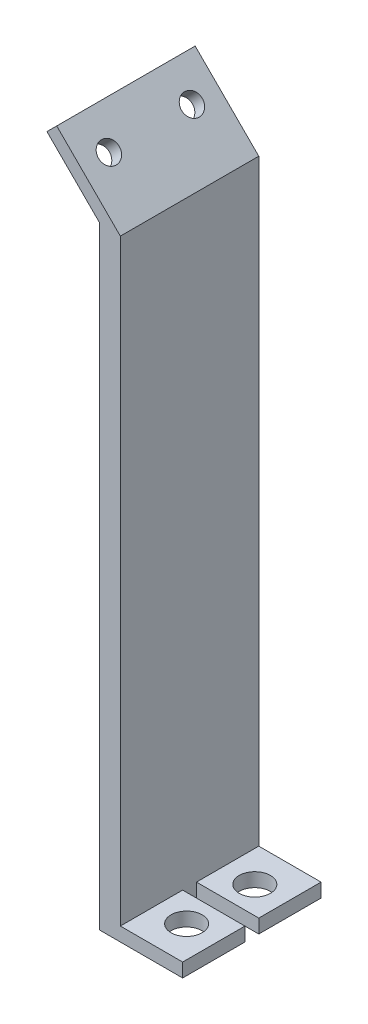
ISO-10303-21;
HEADER;
FILE_DESCRIPTION(('STEP AP214'),'2;1');
FILE_NAME('part.step','',(''),(''),'','','');
FILE_SCHEMA(('AUTOMOTIVE_DESIGN { 1 0 10303 214 1 1 1 1 }'));
ENDSEC;
DATA;
#1=APPLICATION_CONTEXT('core data for automotive mechanical design processes');
#2=APPLICATION_PROTOCOL_DEFINITION('international standard','automotive_design',2000,#1);
#3=PRODUCT_CONTEXT('',#1,'mechanical');
#4=PRODUCT('Part','Part','',(#3));
#5=PRODUCT_RELATED_PRODUCT_CATEGORY('part','',(#4));
#6=PRODUCT_DEFINITION_FORMATION('','',#4);
#7=PRODUCT_DEFINITION_CONTEXT('part definition',#1,'design');
#8=PRODUCT_DEFINITION('design','',#6,#7);
#9=PRODUCT_DEFINITION_SHAPE('','',#8);
#10=(LENGTH_UNIT() NAMED_UNIT(*) SI_UNIT(.MILLI.,.METRE.));
#11=(NAMED_UNIT(*) PLANE_ANGLE_UNIT() SI_UNIT($,.RADIAN.));
#12=(NAMED_UNIT(*) SI_UNIT($,.STERADIAN.) SOLID_ANGLE_UNIT());
#13=UNCERTAINTY_MEASURE_WITH_UNIT(LENGTH_MEASURE(1.E-05),#10,'distance_accuracy_value','');
#14=(GEOMETRIC_REPRESENTATION_CONTEXT(3) GLOBAL_UNCERTAINTY_ASSIGNED_CONTEXT((#13)) GLOBAL_UNIT_ASSIGNED_CONTEXT((#10,
#11,#12)) REPRESENTATION_CONTEXT('',''));
#15=CARTESIAN_POINT('',(0.,0.,0.));
#16=DIRECTION('',(0.,0.,1.));
#17=DIRECTION('',(1.,0.,0.));
#18=AXIS2_PLACEMENT_3D('',#15,#16,#17);
#19=CARTESIAN_POINT('',(11.875,-83.5,-5.625));
#20=DIRECTION('',(1.,0.,0.));
#21=DIRECTION('',(0.,1.,0.));
#22=AXIS2_PLACEMENT_3D('',#19,#20,#21);
#23=PLANE('',#22);
#24=DIRECTION('',(0.,0.,1.));
#25=VECTOR('',#24,1.);
#26=CARTESIAN_POINT('',(11.875,-83.5,-5.625));
#27=LINE('',#26,#25);
#28=CARTESIAN_POINT('',(11.875,-83.5,3.37500000000003));
#29=VERTEX_POINT('',#28);
#30=CARTESIAN_POINT('',(11.875,-83.5,5.375));
#31=VERTEX_POINT('',#30);
#32=EDGE_CURVE('E63',#29,#31,#27,.T.);
#33=ORIENTED_EDGE('',*,*,#32,.F.);
#34=DIRECTION('',(0.,-1.,0.));
#35=VECTOR('',#34,1.);
#36=CARTESIAN_POINT('',(11.875,-83.5,3.37500000000003));
#37=LINE('',#36,#35);
#38=CARTESIAN_POINT('',(11.875,-81.5,3.37500000000003));
#39=VERTEX_POINT('',#38);
#40=EDGE_CURVE('E58',#39,#29,#37,.T.);
#41=ORIENTED_EDGE('',*,*,#40,.F.);
#42=DIRECTION('',(0.,0.,1.));
#43=VECTOR('',#42,1.);
#44=CARTESIAN_POINT('',(11.875,-81.5,3.37500000000003));
#45=LINE('',#44,#43);
#46=CARTESIAN_POINT('',(11.875,-81.5,-5.625));
#47=VERTEX_POINT('',#46);
#48=EDGE_CURVE('E150',#47,#39,#45,.T.);
#49=ORIENTED_EDGE('',*,*,#48,.F.);
#50=DIRECTION('',(0.,1.,0.));
#51=VECTOR('',#50,1.);
#52=CARTESIAN_POINT('',(11.875,-83.5,-5.625));
#53=LINE('',#52,#51);
#54=CARTESIAN_POINT('',(11.875,4.8284271247462,-5.625));
#55=VERTEX_POINT('',#54);
#56=EDGE_CURVE('E191',#47,#55,#53,.T.);
#57=ORIENTED_EDGE('',*,*,#56,.T.);
#58=DIRECTION('',(0.,0.,1.));
#59=VECTOR('',#58,1.);
#60=CARTESIAN_POINT('',(11.875,4.8284271247462,-5.625));
#61=LINE('',#60,#59);
#62=CARTESIAN_POINT('',(11.875,4.8284271247462,14.375));
#63=VERTEX_POINT('',#62);
#64=EDGE_CURVE('E220',#55,#63,#61,.T.);
#65=ORIENTED_EDGE('',*,*,#64,.T.);
#66=DIRECTION('',(0.,1.,0.));
#67=VECTOR('',#66,1.);
#68=CARTESIAN_POINT('',(11.875,-83.5,14.375));
#69=LINE('',#68,#67);
#70=CARTESIAN_POINT('',(11.875,-81.5,14.375));
#71=VERTEX_POINT('',#70);
#72=EDGE_CURVE('E207',#71,#63,#69,.T.);
#73=ORIENTED_EDGE('',*,*,#72,.F.);
#74=DIRECTION('',(0.,0.,1.));
#75=VECTOR('',#74,1.);
#76=CARTESIAN_POINT('',(11.875,-81.5,14.375));
#77=LINE('',#76,#75);
#78=CARTESIAN_POINT('',(11.875,-81.5,5.375));
#79=VERTEX_POINT('',#78);
#80=EDGE_CURVE('E157',#79,#71,#77,.T.);
#81=ORIENTED_EDGE('',*,*,#80,.F.);
#82=DIRECTION('',(0.,1.,0.));
#83=VECTOR('',#82,1.);
#84=CARTESIAN_POINT('',(11.875,-81.5,5.375));
#85=LINE('',#84,#83);
#86=EDGE_CURVE('E153',#31,#79,#85,.T.);
#87=ORIENTED_EDGE('',*,*,#86,.F.);
#88=EDGE_LOOP('',(#33,#41,#49,#57,#65,#73,#81,#87));
#89=FACE_BOUND('',#88,.T.);
#90=ADVANCED_FACE('F41',(#89),#23,.T.);
#91=CARTESIAN_POINT('',(8.875,5.,-5.625));
#92=DIRECTION('',(-1.,0.,0.));
#93=DIRECTION('',(0.,0.,1.));
#94=AXIS2_PLACEMENT_3D('',#91,#92,#93);
#95=PLANE('',#94);
#96=DIRECTION('',(0.,-1.,0.));
#97=VECTOR('',#96,1.);
#98=CARTESIAN_POINT('',(8.875,5.,14.375));
#99=LINE('',#98,#97);
#100=CARTESIAN_POINT('',(8.875,5.,14.375));
#101=VERTEX_POINT('',#100);
#102=CARTESIAN_POINT('',(8.875,-83.5,14.375));
#103=VERTEX_POINT('',#102);
#104=EDGE_CURVE('E185',#101,#103,#99,.T.);
#105=ORIENTED_EDGE('',*,*,#104,.F.);
#106=DIRECTION('',(0.,0.,1.));
#107=VECTOR('',#106,1.);
#108=CARTESIAN_POINT('',(8.875,5.,-5.625));
#109=LINE('',#108,#107);
#110=CARTESIAN_POINT('',(8.875,5.,-5.625));
#111=VERTEX_POINT('',#110);
#112=EDGE_CURVE('E11',#111,#101,#109,.T.);
#113=ORIENTED_EDGE('',*,*,#112,.F.);
#114=DIRECTION('',(0.,-1.,0.));
#115=VECTOR('',#114,1.);
#116=CARTESIAN_POINT('',(8.875,5.,-5.625));
#117=LINE('',#116,#115);
#118=CARTESIAN_POINT('',(8.875,-83.5,-5.625));
#119=VERTEX_POINT('',#118);
#120=EDGE_CURVE('E186',#111,#119,#117,.T.);
#121=ORIENTED_EDGE('',*,*,#120,.T.);
#122=DIRECTION('',(0.,0.,1.));
#123=VECTOR('',#122,1.);
#124=CARTESIAN_POINT('',(8.875,-83.5,-5.625));
#125=LINE('',#124,#123);
#126=EDGE_CURVE('E202',#119,#103,#125,.T.);
#127=ORIENTED_EDGE('',*,*,#126,.T.);
#128=EDGE_LOOP('',(#105,#113,#121,#127));
#129=FACE_BOUND('',#128,.T.);
#130=ADVANCED_FACE('F43',(#129),#95,.T.);
#131=CARTESIAN_POINT('',(1.26839828220179,12.6066017177982,-5.625));
#132=DIRECTION('',(-0.707106781186548,-0.707106781186547,0.));
#133=DIRECTION('',(0.707106781186547,-0.707106781186548,0.));
#134=AXIS2_PLACEMENT_3D('',#131,#132,#133);
#135=PLANE('',#134);
#136=CARTESIAN_POINT('',(4.80393218813461,9.0710678118654,10.375));
#137=DIRECTION('',(-0.707106781186548,-0.707106781186547,0.));
#138=DIRECTION('',(0.707106781186547,-0.707106781186548,0.));
#139=AXIS2_PLACEMENT_3D('',#136,#137,#138);
#140=CIRCLE('',#139,1.50000000000012);
#141=CARTESIAN_POINT('',(5.86459235991451,8.0104076400855,10.375));
#142=VERTEX_POINT('',#141);
#143=EDGE_CURVE('E226',#142,#142,#140,.T.);
#144=ORIENTED_EDGE('',*,*,#143,.F.);
#145=EDGE_LOOP('',(#144));
#146=FACE_BOUND('',#145,.T.);
#147=CARTESIAN_POINT('',(4.80393218813466,9.07106781186535,-1.62499999999996));
#148=DIRECTION('',(-0.707106781186548,-0.707106781186547,0.));
#149=DIRECTION('',(0.707106781186547,-0.707106781186548,0.));
#150=AXIS2_PLACEMENT_3D('',#147,#148,#149);
#151=CIRCLE('',#150,1.50000000000012);
#152=CARTESIAN_POINT('',(5.86459235991456,8.01040764008544,-1.62499999999996));
#153=VERTEX_POINT('',#152);
#154=EDGE_CURVE('E243',#153,#153,#151,.T.);
#155=ORIENTED_EDGE('',*,*,#154,.F.);
#156=EDGE_LOOP('',(#155));
#157=FACE_BOUND('',#156,.T.);
#158=DIRECTION('',(0.707106781186547,-0.707106781186548,0.));
#159=VECTOR('',#158,1.);
#160=CARTESIAN_POINT('',(1.26839828220179,12.6066017177982,14.375));
#161=LINE('',#160,#159);
#162=CARTESIAN_POINT('',(1.26839828220179,12.6066017177982,14.375));
#163=VERTEX_POINT('',#162);
#164=EDGE_CURVE('E189',#163,#101,#161,.T.);
#165=ORIENTED_EDGE('',*,*,#164,.F.);
#166=DIRECTION('',(0.,0.,1.));
#167=VECTOR('',#166,1.);
#168=CARTESIAN_POINT('',(1.26839828220179,12.6066017177982,-5.625));
#169=LINE('',#168,#167);
#170=CARTESIAN_POINT('',(1.26839828220179,12.6066017177982,-5.625));
#171=VERTEX_POINT('',#170);
#172=EDGE_CURVE('E50',#171,#163,#169,.T.);
#173=ORIENTED_EDGE('',*,*,#172,.F.);
#174=DIRECTION('',(0.707106781186547,-0.707106781186548,0.));
#175=VECTOR('',#174,1.);
#176=CARTESIAN_POINT('',(1.26839828220179,12.6066017177982,-5.625));
#177=LINE('',#176,#175);
#178=EDGE_CURVE('E199',#171,#111,#177,.T.);
#179=ORIENTED_EDGE('',*,*,#178,.T.);
#180=ORIENTED_EDGE('',*,*,#112,.T.);
#181=EDGE_LOOP('',(#165,#173,#179,#180));
#182=FACE_BOUND('',#181,.T.);
#183=ADVANCED_FACE('F286',(#146,#157,#182),#135,.T.);
#184=CARTESIAN_POINT('',(2.68261184457489,14.0208152801713,-5.625));
#185=DIRECTION('',(-0.707106781186548,0.707106781186547,0.));
#186=DIRECTION('',(-0.707106781186547,-0.707106781186548,0.));
#187=AXIS2_PLACEMENT_3D('',#184,#185,#186);
#188=PLANE('',#187);
#189=DIRECTION('',(-0.707106781186547,-0.707106781186548,0.));
#190=VECTOR('',#189,1.);
#191=CARTESIAN_POINT('',(2.68261184457489,14.0208152801713,14.375));
#192=LINE('',#191,#190);
#193=CARTESIAN_POINT('',(2.68261184457489,14.0208152801713,14.375));
#194=VERTEX_POINT('',#193);
#195=EDGE_CURVE('E212',#194,#163,#192,.T.);
#196=ORIENTED_EDGE('',*,*,#195,.F.);
#197=DIRECTION('',(0.,0.,1.));
#198=VECTOR('',#197,1.);
#199=CARTESIAN_POINT('',(2.68261184457489,14.0208152801713,-5.625));
#200=LINE('',#199,#198);
#201=CARTESIAN_POINT('',(2.68261184457489,14.0208152801713,-5.625));
#202=VERTEX_POINT('',#201);
#203=EDGE_CURVE('E218',#202,#194,#200,.T.);
#204=ORIENTED_EDGE('',*,*,#203,.F.);
#205=DIRECTION('',(-0.707106781186547,-0.707106781186548,0.));
#206=VECTOR('',#205,1.);
#207=CARTESIAN_POINT('',(2.68261184457489,14.0208152801713,-5.625));
#208=LINE('',#207,#206);
#209=EDGE_CURVE('E196',#202,#171,#208,.T.);
#210=ORIENTED_EDGE('',*,*,#209,.T.);
#211=ORIENTED_EDGE('',*,*,#172,.T.);
#212=EDGE_LOOP('',(#196,#204,#210,#211));
#213=FACE_BOUND('',#212,.T.);
#214=ADVANCED_FACE('F267',(#213),#188,.T.);
#215=CARTESIAN_POINT('',(11.875,4.8284271247462,-5.625));
#216=DIRECTION('',(0.707106781186548,0.707106781186547,0.));
#217=DIRECTION('',(-0.707106781186547,0.707106781186548,0.));
#218=AXIS2_PLACEMENT_3D('',#215,#216,#217);
#219=PLANE('',#218);
#220=CARTESIAN_POINT('',(6.21814575050771,10.4852813742385,10.375));
#221=DIRECTION('',(0.707106781186548,0.707106781186547,0.));
#222=DIRECTION('',(-0.707106781186547,0.707106781186548,0.));
#223=AXIS2_PLACEMENT_3D('',#220,#221,#222);
#224=CIRCLE('',#223,1.50000000000012);
#225=CARTESIAN_POINT('',(5.1574855787278,11.5459415460184,10.375));
#226=VERTEX_POINT('',#225);
#227=EDGE_CURVE('E231',#226,#226,#224,.T.);
#228=ORIENTED_EDGE('',*,*,#227,.F.);
#229=EDGE_LOOP('',(#228));
#230=FACE_BOUND('',#229,.T.);
#231=CARTESIAN_POINT('',(6.21814575050776,10.4852813742384,-1.62499999999996));
#232=DIRECTION('',(0.707106781186548,0.707106781186547,0.));
#233=DIRECTION('',(-0.707106781186547,0.707106781186548,0.));
#234=AXIS2_PLACEMENT_3D('',#231,#232,#233);
#235=CIRCLE('',#234,1.50000000000012);
#236=CARTESIAN_POINT('',(5.15748557872786,11.5459415460184,-1.62499999999996));
#237=VERTEX_POINT('',#236);
#238=EDGE_CURVE('E246',#237,#237,#235,.T.);
#239=ORIENTED_EDGE('',*,*,#238,.F.);
#240=EDGE_LOOP('',(#239));
#241=FACE_BOUND('',#240,.T.);
#242=DIRECTION('',(-0.707106781186547,0.707106781186548,0.));
#243=VECTOR('',#242,1.);
#244=CARTESIAN_POINT('',(11.875,4.8284271247462,14.375));
#245=LINE('',#244,#243);
#246=EDGE_CURVE('E209',#63,#194,#245,.T.);
#247=ORIENTED_EDGE('',*,*,#246,.F.);
#248=ORIENTED_EDGE('',*,*,#64,.F.);
#249=DIRECTION('',(-0.707106781186547,0.707106781186548,0.));
#250=VECTOR('',#249,1.);
#251=CARTESIAN_POINT('',(11.875,4.8284271247462,-5.625));
#252=LINE('',#251,#250);
#253=EDGE_CURVE('E193',#55,#202,#252,.T.);
#254=ORIENTED_EDGE('',*,*,#253,.T.);
#255=ORIENTED_EDGE('',*,*,#203,.T.);
#256=EDGE_LOOP('',(#247,#248,#254,#255));
#257=FACE_BOUND('',#256,.T.);
#258=ADVANCED_FACE('F260',(#230,#241,#257),#219,.T.);
#259=CARTESIAN_POINT('',(8.875,-83.5,-5.625));
#260=DIRECTION('',(0.,-1.,0.));
#261=DIRECTION('',(0.,0.,-1.));
#262=AXIS2_PLACEMENT_3D('',#259,#260,#261);
#263=PLANE('',#262);
#264=CARTESIAN_POINT('',(16.375,-83.5,9.3));
#265=DIRECTION('',(0.,-1.,0.));
#266=DIRECTION('',(0.,0.,-1.));
#267=AXIS2_PLACEMENT_3D('',#264,#265,#266);
#268=CIRCLE('',#267,2.24999999999999);
#269=CARTESIAN_POINT('',(16.375,-83.5,7.05000000000001));
#270=VERTEX_POINT('',#269);
#271=EDGE_CURVE('E238',#270,#270,#268,.T.);
#272=ORIENTED_EDGE('',*,*,#271,.F.);
#273=EDGE_LOOP('',(#272));
#274=FACE_BOUND('',#273,.T.);
#275=CARTESIAN_POINT('',(16.375,-83.5,-0.549999999999967));
#276=DIRECTION('',(0.,-1.,0.));
#277=DIRECTION('',(0.,0.,-1.));
#278=AXIS2_PLACEMENT_3D('',#275,#276,#277);
#279=CIRCLE('',#278,2.24999999999999);
#280=CARTESIAN_POINT('',(16.375,-83.5,-2.79999999999996));
#281=VERTEX_POINT('',#280);
#282=EDGE_CURVE('E227',#281,#281,#279,.T.);
#283=ORIENTED_EDGE('',*,*,#282,.F.);
#284=EDGE_LOOP('',(#283));
#285=FACE_BOUND('',#284,.T.);
#286=DIRECTION('',(1.,0.,0.));
#287=VECTOR('',#286,1.);
#288=CARTESIAN_POINT('',(8.875,-83.5,14.375));
#289=LINE('',#288,#287);
#290=CARTESIAN_POINT('',(20.875,-83.5,14.375));
#291=VERTEX_POINT('',#290);
#292=EDGE_CURVE('E205',#103,#291,#289,.T.);
#293=ORIENTED_EDGE('',*,*,#292,.F.);
#294=ORIENTED_EDGE('',*,*,#126,.F.);
#295=DIRECTION('',(1.,0.,0.));
#296=VECTOR('',#295,1.);
#297=CARTESIAN_POINT('',(8.875,-83.5,-5.625));
#298=LINE('',#297,#296);
#299=CARTESIAN_POINT('',(20.875,-83.5,-5.625));
#300=VERTEX_POINT('',#299);
#301=EDGE_CURVE('E137',#119,#300,#298,.T.);
#302=ORIENTED_EDGE('',*,*,#301,.T.);
#303=DIRECTION('',(0.,0.,-1.));
#304=VECTOR('',#303,1.);
#305=CARTESIAN_POINT('',(20.875,-83.5,-5.625));
#306=LINE('',#305,#304);
#307=CARTESIAN_POINT('',(20.875,-83.5,3.37500000000003));
#308=VERTEX_POINT('',#307);
#309=EDGE_CURVE('E130',#308,#300,#306,.T.);
#310=ORIENTED_EDGE('',*,*,#309,.F.);
#311=DIRECTION('',(-1.,0.,0.));
#312=VECTOR('',#311,1.);
#313=CARTESIAN_POINT('',(20.875,-83.5,3.37500000000003));
#314=LINE('',#313,#312);
#315=EDGE_CURVE('E135',#308,#29,#314,.T.);
#316=ORIENTED_EDGE('',*,*,#315,.T.);
#317=ORIENTED_EDGE('',*,*,#32,.T.);
#318=DIRECTION('',(-1.,0.,0.));
#319=VECTOR('',#318,1.);
#320=CARTESIAN_POINT('',(20.875,-83.5,5.375));
#321=LINE('',#320,#319);
#322=CARTESIAN_POINT('',(20.875,-83.5,5.375));
#323=VERTEX_POINT('',#322);
#324=EDGE_CURVE('E173',#323,#31,#321,.T.);
#325=ORIENTED_EDGE('',*,*,#324,.F.);
#326=DIRECTION('',(0.,0.,-1.));
#327=VECTOR('',#326,1.);
#328=CARTESIAN_POINT('',(20.875,-83.5,5.375));
#329=LINE('',#328,#327);
#330=EDGE_CURVE('E172',#291,#323,#329,.T.);
#331=ORIENTED_EDGE('',*,*,#330,.F.);
#332=EDGE_LOOP('',(#293,#294,#302,#310,#316,#317,#325,#331));
#333=FACE_BOUND('',#332,.T.);
#334=ADVANCED_FACE('F133',(#274,#285,#333),#263,.T.);
#335=CARTESIAN_POINT('',(0.,0.,-5.625));
#336=DIRECTION('',(0.,0.,1.));
#337=DIRECTION('',(1.,0.,0.));
#338=AXIS2_PLACEMENT_3D('',#335,#336,#337);
#339=PLANE('',#338);
#340=ORIENTED_EDGE('',*,*,#120,.F.);
#341=ORIENTED_EDGE('',*,*,#178,.F.);
#342=ORIENTED_EDGE('',*,*,#209,.F.);
#343=ORIENTED_EDGE('',*,*,#253,.F.);
#344=ORIENTED_EDGE('',*,*,#56,.F.);
#345=DIRECTION('',(-1.,0.,0.));
#346=VECTOR('',#345,1.);
#347=CARTESIAN_POINT('',(20.875,-81.5,-5.625));
#348=LINE('',#347,#346);
#349=CARTESIAN_POINT('',(20.875,-81.5,-5.625));
#350=VERTEX_POINT('',#349);
#351=EDGE_CURVE('E154',#350,#47,#348,.T.);
#352=ORIENTED_EDGE('',*,*,#351,.F.);
#353=DIRECTION('',(0.,1.,0.));
#354=VECTOR('',#353,1.);
#355=CARTESIAN_POINT('',(20.875,-81.5,-5.625));
#356=LINE('',#355,#354);
#357=EDGE_CURVE('E140',#300,#350,#356,.T.);
#358=ORIENTED_EDGE('',*,*,#357,.F.);
#359=ORIENTED_EDGE('',*,*,#301,.F.);
#360=EDGE_LOOP('',(#340,#341,#342,#343,#344,#352,#358,#359));
#361=FACE_BOUND('',#360,.T.);
#362=ADVANCED_FACE('F263',(#361),#339,.F.);
#363=CARTESIAN_POINT('',(0.,0.,14.375));
#364=DIRECTION('',(0.,0.,1.));
#365=DIRECTION('',(1.,0.,0.));
#366=AXIS2_PLACEMENT_3D('',#363,#364,#365);
#367=PLANE('',#366);
#368=ORIENTED_EDGE('',*,*,#104,.T.);
#369=ORIENTED_EDGE('',*,*,#292,.T.);
#370=DIRECTION('',(0.,-1.,0.));
#371=VECTOR('',#370,1.);
#372=CARTESIAN_POINT('',(20.875,-83.5,14.375));
#373=LINE('',#372,#371);
#374=CARTESIAN_POINT('',(20.875,-81.5,14.375));
#375=VERTEX_POINT('',#374);
#376=EDGE_CURVE('E169',#375,#291,#373,.T.);
#377=ORIENTED_EDGE('',*,*,#376,.F.);
#378=DIRECTION('',(-1.,0.,0.));
#379=VECTOR('',#378,1.);
#380=CARTESIAN_POINT('',(20.875,-81.5,14.375));
#381=LINE('',#380,#379);
#382=EDGE_CURVE('E179',#375,#71,#381,.T.);
#383=ORIENTED_EDGE('',*,*,#382,.T.);
#384=ORIENTED_EDGE('',*,*,#72,.T.);
#385=ORIENTED_EDGE('',*,*,#246,.T.);
#386=ORIENTED_EDGE('',*,*,#195,.T.);
#387=ORIENTED_EDGE('',*,*,#164,.T.);
#388=EDGE_LOOP('',(#368,#369,#377,#383,#384,#385,#386,#387));
#389=FACE_BOUND('',#388,.T.);
#390=ADVANCED_FACE('F270',(#389),#367,.T.);
#391=CARTESIAN_POINT('',(20.875,-81.5,5.375));
#392=DIRECTION('',(0.,0.,1.));
#393=DIRECTION('',(1.,0.,0.));
#394=AXIS2_PLACEMENT_3D('',#391,#392,#393);
#395=PLANE('',#394);
#396=ORIENTED_EDGE('',*,*,#86,.T.);
#397=DIRECTION('',(-1.,0.,0.));
#398=VECTOR('',#397,1.);
#399=CARTESIAN_POINT('',(20.875,-81.5,5.375));
#400=LINE('',#399,#398);
#401=CARTESIAN_POINT('',(20.875,-81.5,5.375));
#402=VERTEX_POINT('',#401);
#403=EDGE_CURVE('E182',#402,#79,#400,.T.);
#404=ORIENTED_EDGE('',*,*,#403,.F.);
#405=DIRECTION('',(0.,1.,0.));
#406=VECTOR('',#405,1.);
#407=CARTESIAN_POINT('',(20.875,-81.5,5.375));
#408=LINE('',#407,#406);
#409=EDGE_CURVE('E164',#323,#402,#408,.T.);
#410=ORIENTED_EDGE('',*,*,#409,.F.);
#411=ORIENTED_EDGE('',*,*,#324,.T.);
#412=EDGE_LOOP('',(#396,#404,#410,#411));
#413=FACE_BOUND('',#412,.T.);
#414=ADVANCED_FACE('F278',(#413),#395,.F.);
#415=CARTESIAN_POINT('',(20.875,-81.5,14.375));
#416=DIRECTION('',(0.,-1.,0.));
#417=DIRECTION('',(1.,0.,0.));
#418=AXIS2_PLACEMENT_3D('',#415,#416,#417);
#419=PLANE('',#418);
#420=CARTESIAN_POINT('',(16.375,-81.5,9.3));
#421=DIRECTION('',(0.,-1.,0.));
#422=DIRECTION('',(1.,0.,0.));
#423=AXIS2_PLACEMENT_3D('',#420,#421,#422);
#424=CIRCLE('',#423,2.24999999999998);
#425=CARTESIAN_POINT('',(18.625,-81.5,9.3));
#426=VERTEX_POINT('',#425);
#427=EDGE_CURVE('E45',#426,#426,#424,.T.);
#428=ORIENTED_EDGE('',*,*,#427,.T.);
#429=EDGE_LOOP('',(#428));
#430=FACE_BOUND('',#429,.T.);
#431=ORIENTED_EDGE('',*,*,#80,.T.);
#432=ORIENTED_EDGE('',*,*,#382,.F.);
#433=DIRECTION('',(0.,0.,1.));
#434=VECTOR('',#433,1.);
#435=CARTESIAN_POINT('',(20.875,-81.5,14.375));
#436=LINE('',#435,#434);
#437=EDGE_CURVE('E167',#402,#375,#436,.T.);
#438=ORIENTED_EDGE('',*,*,#437,.F.);
#439=ORIENTED_EDGE('',*,*,#403,.T.);
#440=EDGE_LOOP('',(#431,#432,#438,#439));
#441=FACE_BOUND('',#440,.T.);
#442=ADVANCED_FACE('F274',(#430,#441),#419,.F.);
#443=CARTESIAN_POINT('',(20.875,0.,0.));
#444=DIRECTION('',(-1.,0.,0.));
#445=DIRECTION('',(0.,0.,1.));
#446=AXIS2_PLACEMENT_3D('',#443,#444,#445);
#447=PLANE('',#446);
#448=ORIENTED_EDGE('',*,*,#409,.T.);
#449=ORIENTED_EDGE('',*,*,#437,.T.);
#450=ORIENTED_EDGE('',*,*,#376,.T.);
#451=ORIENTED_EDGE('',*,*,#330,.T.);
#452=EDGE_LOOP('',(#448,#449,#450,#451));
#453=FACE_BOUND('',#452,.T.);
#454=ADVANCED_FACE('F282',(#453),#447,.F.);
#455=CARTESIAN_POINT('',(20.875,-83.5,3.37500000000003));
#456=DIRECTION('',(0.,0.,-1.));
#457=DIRECTION('',(-1.,0.,0.));
#458=AXIS2_PLACEMENT_3D('',#455,#456,#457);
#459=PLANE('',#458);
#460=ORIENTED_EDGE('',*,*,#40,.T.);
#461=ORIENTED_EDGE('',*,*,#315,.F.);
#462=DIRECTION('',(0.,-1.,0.));
#463=VECTOR('',#462,1.);
#464=CARTESIAN_POINT('',(20.875,-83.5,3.37500000000003));
#465=LINE('',#464,#463);
#466=CARTESIAN_POINT('',(20.875,-81.5,3.37500000000003));
#467=VERTEX_POINT('',#466);
#468=EDGE_CURVE('E141',#467,#308,#465,.T.);
#469=ORIENTED_EDGE('',*,*,#468,.F.);
#470=DIRECTION('',(-1.,0.,0.));
#471=VECTOR('',#470,1.);
#472=CARTESIAN_POINT('',(20.875,-81.5,3.37500000000003));
#473=LINE('',#472,#471);
#474=EDGE_CURVE('E160',#467,#39,#473,.T.);
#475=ORIENTED_EDGE('',*,*,#474,.T.);
#476=EDGE_LOOP('',(#460,#461,#469,#475));
#477=FACE_BOUND('',#476,.T.);
#478=ADVANCED_FACE('F152',(#477),#459,.F.);
#479=CARTESIAN_POINT('',(20.875,-81.5,3.37500000000003));
#480=DIRECTION('',(0.,-1.,0.));
#481=DIRECTION('',(1.,0.,0.));
#482=AXIS2_PLACEMENT_3D('',#479,#480,#481);
#483=PLANE('',#482);
#484=CARTESIAN_POINT('',(16.375,-81.5,-0.549999999999967));
#485=DIRECTION('',(0.,-1.,0.));
#486=DIRECTION('',(1.,0.,0.));
#487=AXIS2_PLACEMENT_3D('',#484,#485,#486);
#488=CIRCLE('',#487,2.24999999999998);
#489=CARTESIAN_POINT('',(18.625,-81.5,-0.549999999999967));
#490=VERTEX_POINT('',#489);
#491=EDGE_CURVE('E224',#490,#490,#488,.T.);
#492=ORIENTED_EDGE('',*,*,#491,.T.);
#493=EDGE_LOOP('',(#492));
#494=FACE_BOUND('',#493,.T.);
#495=ORIENTED_EDGE('',*,*,#48,.T.);
#496=ORIENTED_EDGE('',*,*,#474,.F.);
#497=DIRECTION('',(0.,0.,1.));
#498=VECTOR('',#497,1.);
#499=CARTESIAN_POINT('',(20.875,-81.5,3.37500000000003));
#500=LINE('',#499,#498);
#501=EDGE_CURVE('E146',#350,#467,#500,.T.);
#502=ORIENTED_EDGE('',*,*,#501,.F.);
#503=ORIENTED_EDGE('',*,*,#351,.T.);
#504=EDGE_LOOP('',(#495,#496,#502,#503));
#505=FACE_BOUND('',#504,.T.);
#506=ADVANCED_FACE('F253',(#494,#505),#483,.F.);
#507=CARTESIAN_POINT('',(20.875,0.,0.));
#508=DIRECTION('',(-1.,0.,0.));
#509=DIRECTION('',(0.,0.,1.));
#510=AXIS2_PLACEMENT_3D('',#507,#508,#509);
#511=PLANE('',#510);
#512=ORIENTED_EDGE('',*,*,#468,.T.);
#513=ORIENTED_EDGE('',*,*,#309,.T.);
#514=ORIENTED_EDGE('',*,*,#357,.T.);
#515=ORIENTED_EDGE('',*,*,#501,.T.);
#516=EDGE_LOOP('',(#512,#513,#514,#515));
#517=FACE_BOUND('',#516,.T.);
#518=ADVANCED_FACE('F144',(#517),#511,.F.);
#519=CARTESIAN_POINT('',(4.80393218813466,9.07106781186535,-1.62499999999996));
#520=DIRECTION('',(-0.707106781186548,-0.707106781186547,0.));
#521=DIRECTION('',(0.707106781186547,-0.707106781186548,0.));
#522=AXIS2_PLACEMENT_3D('',#519,#520,#521);
#523=CYLINDRICAL_SURFACE('',#522,1.50000000000012);
#524=ORIENTED_EDGE('',*,*,#238,.T.);
#525=EDGE_LOOP('',(#524));
#526=FACE_BOUND('',#525,.T.);
#527=ORIENTED_EDGE('',*,*,#154,.T.);
#528=EDGE_LOOP('',(#527));
#529=FACE_BOUND('',#528,.T.);
#530=ADVANCED_FACE('F394',(#526,#529),#523,.F.);
#531=CARTESIAN_POINT('',(4.80393218813461,9.0710678118654,10.375));
#532=DIRECTION('',(-0.707106781186548,-0.707106781186547,0.));
#533=DIRECTION('',(0.707106781186547,-0.707106781186548,0.));
#534=AXIS2_PLACEMENT_3D('',#531,#532,#533);
#535=CYLINDRICAL_SURFACE('',#534,1.50000000000012);
#536=ORIENTED_EDGE('',*,*,#227,.T.);
#537=EDGE_LOOP('',(#536));
#538=FACE_BOUND('',#537,.T.);
#539=ORIENTED_EDGE('',*,*,#143,.T.);
#540=EDGE_LOOP('',(#539));
#541=FACE_BOUND('',#540,.T.);
#542=ADVANCED_FACE('F403',(#538,#541),#535,.F.);
#543=CARTESIAN_POINT('',(16.375,-83.5,-0.549999999999967));
#544=DIRECTION('',(0.,-1.,0.));
#545=DIRECTION('',(0.,0.,-1.));
#546=AXIS2_PLACEMENT_3D('',#543,#544,#545);
#547=CYLINDRICAL_SURFACE('',#546,2.24999999999998);
#548=ORIENTED_EDGE('',*,*,#282,.T.);
#549=EDGE_LOOP('',(#548));
#550=FACE_BOUND('',#549,.T.);
#551=ORIENTED_EDGE('',*,*,#491,.F.);
#552=EDGE_LOOP('',(#551));
#553=FACE_BOUND('',#552,.T.);
#554=ADVANCED_FACE('F322',(#550,#553),#547,.F.);
#555=CARTESIAN_POINT('',(16.375,-83.5,9.3));
#556=DIRECTION('',(0.,-1.,0.));
#557=DIRECTION('',(0.,0.,-1.));
#558=AXIS2_PLACEMENT_3D('',#555,#556,#557);
#559=CYLINDRICAL_SURFACE('',#558,2.24999999999998);
#560=ORIENTED_EDGE('',*,*,#271,.T.);
#561=EDGE_LOOP('',(#560));
#562=FACE_BOUND('',#561,.T.);
#563=ORIENTED_EDGE('',*,*,#427,.F.);
#564=EDGE_LOOP('',(#563));
#565=FACE_BOUND('',#564,.T.);
#566=ADVANCED_FACE('F319',(#562,#565),#559,.F.);
#567=CLOSED_SHELL('',(#90,#130,#183,#214,#258,#334,#362,#390,#414,#442,#454,#478,#506,#518,#530,
#542,#554,#566));
#568=MANIFOLD_SOLID_BREP('B2',#567);
#569=ADVANCED_BREP_SHAPE_REPRESENTATION('',(#18,#568),#14);
#570=SHAPE_DEFINITION_REPRESENTATION(#9,#569);
ENDSEC;
END-ISO-10303-21;
